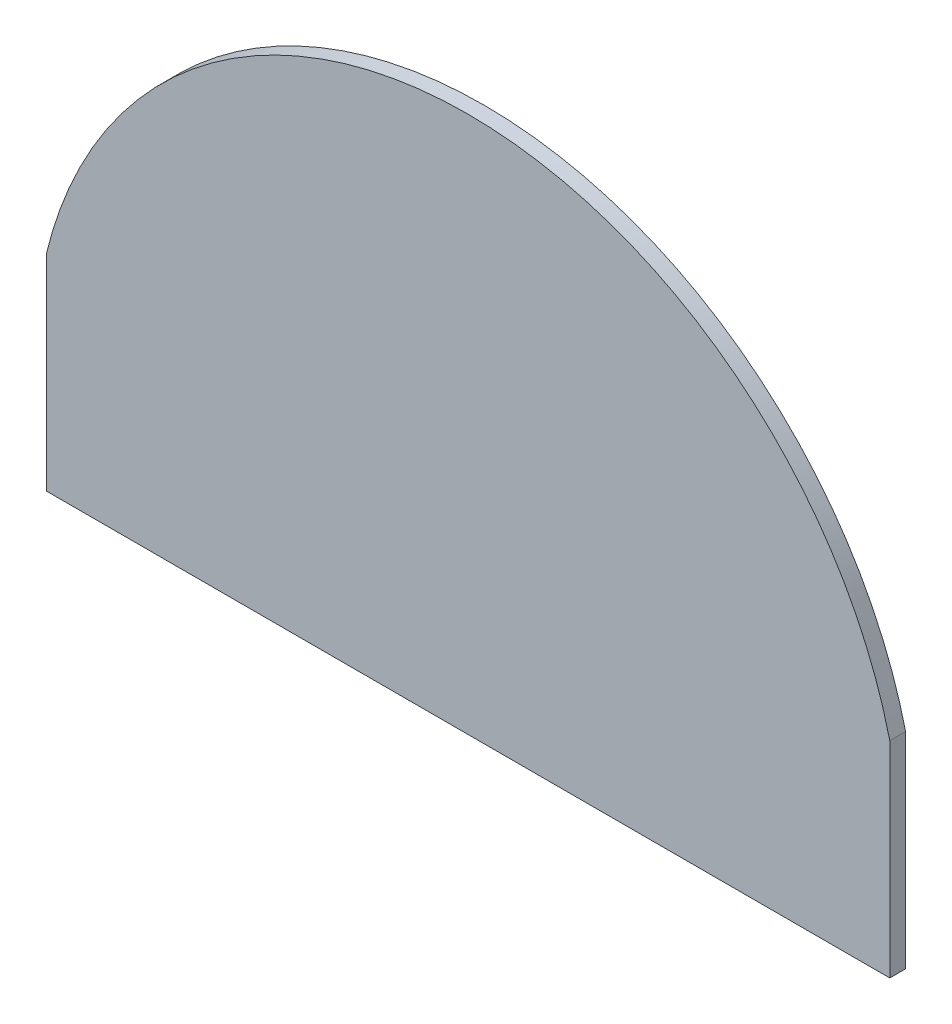
ISO-10303-21;
HEADER;
FILE_DESCRIPTION(('STEP AP214'),'2;1');
FILE_NAME('part.step','',(''),(''),'','','');
FILE_SCHEMA(('AUTOMOTIVE_DESIGN { 1 0 10303 214 1 1 1 1 }'));
ENDSEC;
DATA;
#1=APPLICATION_CONTEXT('core data for automotive mechanical design processes');
#2=APPLICATION_PROTOCOL_DEFINITION('international standard','automotive_design',2000,#1);
#3=PRODUCT_CONTEXT('',#1,'mechanical');
#4=PRODUCT('Part','Part','',(#3));
#5=PRODUCT_RELATED_PRODUCT_CATEGORY('part','',(#4));
#6=PRODUCT_DEFINITION_FORMATION('','',#4);
#7=PRODUCT_DEFINITION_CONTEXT('part definition',#1,'design');
#8=PRODUCT_DEFINITION('design','',#6,#7);
#9=PRODUCT_DEFINITION_SHAPE('','',#8);
#10=(LENGTH_UNIT() NAMED_UNIT(*) SI_UNIT(.MILLI.,.METRE.));
#11=(NAMED_UNIT(*) PLANE_ANGLE_UNIT() SI_UNIT($,.RADIAN.));
#12=(NAMED_UNIT(*) SI_UNIT($,.STERADIAN.) SOLID_ANGLE_UNIT());
#13=UNCERTAINTY_MEASURE_WITH_UNIT(LENGTH_MEASURE(1.E-05),#10,'distance_accuracy_value','');
#14=(GEOMETRIC_REPRESENTATION_CONTEXT(3) GLOBAL_UNCERTAINTY_ASSIGNED_CONTEXT((#13)) GLOBAL_UNIT_ASSIGNED_CONTEXT((#10,
#11,#12)) REPRESENTATION_CONTEXT('',''));
#15=CARTESIAN_POINT('',(0.,0.,0.));
#16=DIRECTION('',(0.,0.,1.));
#17=DIRECTION('',(1.,0.,0.));
#18=AXIS2_PLACEMENT_3D('',#15,#16,#17);
#19=CARTESIAN_POINT('',(80.,5.,53.));
#20=DIRECTION('',(0.,1.,0.));
#21=DIRECTION('',(0.,0.,1.));
#22=AXIS2_PLACEMENT_3D('',#19,#20,#21);
#23=PLANE('',#22);
#24=DIRECTION('',(1.,0.,0.));
#25=VECTOR('',#24,1.);
#26=CARTESIAN_POINT('',(80.,5.,50.));
#27=LINE('',#26,#25);
#28=CARTESIAN_POINT('',(-80.,5.,50.));
#29=VERTEX_POINT('',#28);
#30=CARTESIAN_POINT('',(80.,5.,50.));
#31=VERTEX_POINT('',#30);
#32=EDGE_CURVE('E123',#29,#31,#27,.T.);
#33=ORIENTED_EDGE('',*,*,#32,.T.);
#34=DIRECTION('',(0.,0.,-1.));
#35=VECTOR('',#34,1.);
#36=CARTESIAN_POINT('',(80.,5.,53.));
#37=LINE('',#36,#35);
#38=CARTESIAN_POINT('',(80.,5.,53.));
#39=VERTEX_POINT('',#38);
#40=EDGE_CURVE('E11',#39,#31,#37,.T.);
#41=ORIENTED_EDGE('',*,*,#40,.F.);
#42=DIRECTION('',(1.,0.,0.));
#43=VECTOR('',#42,1.);
#44=CARTESIAN_POINT('',(80.,5.,53.));
#45=LINE('',#44,#43);
#46=CARTESIAN_POINT('',(-80.,5.,53.));
#47=VERTEX_POINT('',#46);
#48=EDGE_CURVE('E88',#47,#39,#45,.T.);
#49=ORIENTED_EDGE('',*,*,#48,.F.);
#50=DIRECTION('',(0.,0.,-1.));
#51=VECTOR('',#50,1.);
#52=CARTESIAN_POINT('',(-80.,5.,53.));
#53=LINE('',#52,#51);
#54=EDGE_CURVE('E129',#47,#29,#53,.T.);
#55=ORIENTED_EDGE('',*,*,#54,.T.);
#56=EDGE_LOOP('',(#33,#41,#49,#55));
#57=FACE_BOUND('',#56,.T.);
#58=ADVANCED_FACE('F33',(#57),#23,.F.);
#59=CARTESIAN_POINT('',(80.,44.,53.));
#60=DIRECTION('',(-1.,0.,0.));
#61=DIRECTION('',(0.,0.,1.));
#62=AXIS2_PLACEMENT_3D('',#59,#60,#61);
#63=PLANE('',#62);
#64=DIRECTION('',(0.,1.,0.));
#65=VECTOR('',#64,1.);
#66=CARTESIAN_POINT('',(80.,44.,50.));
#67=LINE('',#66,#65);
#68=CARTESIAN_POINT('',(80.,44.,50.));
#69=VERTEX_POINT('',#68);
#70=EDGE_CURVE('E92',#31,#69,#67,.T.);
#71=ORIENTED_EDGE('',*,*,#70,.T.);
#72=DIRECTION('',(0.,0.,-1.));
#73=VECTOR('',#72,1.);
#74=CARTESIAN_POINT('',(80.,44.,53.));
#75=LINE('',#74,#73);
#76=CARTESIAN_POINT('',(80.,44.,53.));
#77=VERTEX_POINT('',#76);
#78=EDGE_CURVE('E42',#77,#69,#75,.T.);
#79=ORIENTED_EDGE('',*,*,#78,.F.);
#80=DIRECTION('',(0.,1.,0.));
#81=VECTOR('',#80,1.);
#82=CARTESIAN_POINT('',(80.,44.,53.));
#83=LINE('',#82,#81);
#84=EDGE_CURVE('E82',#39,#77,#83,.T.);
#85=ORIENTED_EDGE('',*,*,#84,.F.);
#86=ORIENTED_EDGE('',*,*,#40,.T.);
#87=EDGE_LOOP('',(#71,#79,#85,#86));
#88=FACE_BOUND('',#87,.T.);
#89=ADVANCED_FACE('F91',(#88),#63,.F.);
#90=CARTESIAN_POINT('',(80.,44.,53.));
#91=CARTESIAN_POINT('',(79.1856423691684,47.3595249154978,53.));
#92=CARTESIAN_POINT('',(78.0909598706326,50.642993584445,53.));
#93=CARTESIAN_POINT('',(76.9963689580524,53.9261875439524,53.));
#94=CARTESIAN_POINT('',(75.6326756633384,57.1005451400095,53.));
#95=CARTESIAN_POINT('',(74.2696153673397,60.2734292637777,53.));
#96=CARTESIAN_POINT('',(72.6431432727945,63.3249304899754,53.));
#97=CARTESIAN_POINT('',(71.0182122542434,66.37354043061,53.));
#98=CARTESIAN_POINT('',(69.1464912003929,69.2713742767161,53.));
#99=CARTESIAN_POINT('',(67.2770787165034,72.1656339512568,53.));
#100=CARTESIAN_POINT('',(65.1695498112878,74.8966771419375,53.));
#101=CARTESIAN_POINT('',(63.0653588745607,77.6233948232083,53.));
#102=CARTESIAN_POINT('',(60.7441394765016,80.1616122153271,53.));
#103=CARTESIAN_POINT('',(58.4273890884949,82.6949428143019,53.));
#104=CARTESIAN_POINT('',(55.9044303575257,85.0290873389293,53.));
#105=CARTESIAN_POINT('',(53.3874784774677,87.3576745557844,53.));
#106=CARTESIAN_POINT('',(50.6886085514487,89.4670048714416,53.));
#107=CARTESIAN_POINT('',(45.4564713291366,93.5562370172015,53.));
#108=CARTESIAN_POINT('',(39.6363700906136,96.7535238934488,53.));
#109=CARTESIAN_POINT('',(33.5997700173089,100.069744935066,53.));
#110=CARTESIAN_POINT('',(27.0992967954393,102.336015415853,53.));
#111=CARTESIAN_POINT('',(20.5644444069193,104.614271561048,53.));
#112=CARTESIAN_POINT('',(13.7400927779922,105.769784194878,53.));
#113=CARTESIAN_POINT('',(10.3332170125164,106.346643097079,53.));
#114=CARTESIAN_POINT('',(6.88899388675884,106.635771433462,53.));
#115=CARTESIAN_POINT('',(3.44801932413832,106.924627066358,53.));
#116=CARTESIAN_POINT('',(0.,106.924604144567,53.));
#117=CARTESIAN_POINT('',(-3.44911350415308,106.924581215502,53.));
#118=CARTESIAN_POINT('',(-6.88899388675888,106.635771433462,53.));
#119=CARTESIAN_POINT('',(-10.3343025012181,106.346505901139,53.));
#120=CARTESIAN_POINT('',(-13.7400927779922,105.769784194878,53.));
#121=CARTESIAN_POINT('',(-20.5655069719298,104.613998253885,53.));
#122=CARTESIAN_POINT('',(-27.0992967954394,102.336015415853,53.));
#123=CARTESIAN_POINT('',(-33.6007668750986,100.069300742823,53.));
#124=CARTESIAN_POINT('',(-39.6363700906137,96.7535238934488,53.));
#125=CARTESIAN_POINT('',(-45.4573794217874,93.5556383978151,53.));
#126=CARTESIAN_POINT('',(-50.6886085514488,89.4670048714416,53.));
#127=CARTESIAN_POINT('',(-53.3883066968154,87.3569699112736,53.));
#128=CARTESIAN_POINT('',(-55.9044303575258,85.0290873389293,53.));
#129=CARTESIAN_POINT('',(-58.4281566217244,82.6941709437084,53.));
#130=CARTESIAN_POINT('',(-60.7441394765017,80.1616122153271,53.));
#131=CARTESIAN_POINT('',(-63.0660615908617,77.6225588258712,53.));
#132=CARTESIAN_POINT('',(-65.1695498112878,74.8966771419375,53.));
#133=CARTESIAN_POINT('',(-67.2777096840496,72.164741527484,53.));
#134=CARTESIAN_POINT('',(-69.1464912003929,69.2713742767161,53.));
#135=CARTESIAN_POINT('',(-71.0187674876344,66.3725961977818,53.));
#136=CARTESIAN_POINT('',(-72.6431432727946,63.3249304899754,53.));
#137=CARTESIAN_POINT('',(-74.270089872002,60.2724414020839,53.));
#138=CARTESIAN_POINT('',(-75.6326756633385,57.1005451400095,53.));
#139=CARTESIAN_POINT('',(-76.9967592893647,53.925162142433,53.));
#140=CARTESIAN_POINT('',(-78.0909598706326,50.642993584445,53.));
#141=CARTESIAN_POINT('',(-79.1857715703775,47.3589919129638,53.));
#142=CARTESIAN_POINT('',(-80.0000000000001,44.,53.));
#143=B_SPLINE_CURVE_WITH_KNOTS('',2,(#90,#91,#92,#93,#94,#95,#96,#97,#98,#99,#100,#101,#102,
#103,#104,#105,#106,#107,#108,#109,#110,#111,#112,#113,#114,#115,#116,#117,#118,#119,#120,#121,
#122,#123,#124,#125,#126,#127,#128,#129,#130,#131,#132,#133,#134,#135,#136,#137,#138,#139,#140,
#141,#142),.UNSPECIFIED.,.F.,.F.,(3,2,2,2,2,2,2,2,2,2,2,2,2,2,2,2,2,2,2,2,2,2,2,2,2,2,3),(0.,
0.03125,0.0625,0.09375,0.125,0.15625,0.1875,0.21875,0.25,0.3125,0.375,0.4375,0.46875,0.5,
0.53125,0.5625,0.625,0.6875,0.75,0.78125,0.8125,0.84375,0.875,0.90625,0.9375,0.96875,1.),.UNSPECIFIED.);
#144=DIRECTION('',(0.,0.,-1.));
#145=VECTOR('',#144,1.);
#146=SURFACE_OF_LINEAR_EXTRUSION('',#143,#145);
#147=CARTESIAN_POINT('',(80.,44.,50.));
#148=CARTESIAN_POINT('',(79.1856423691684,47.3595249154978,50.));
#149=CARTESIAN_POINT('',(78.0909598706326,50.642993584445,50.));
#150=CARTESIAN_POINT('',(76.9963689580524,53.9261875439524,50.));
#151=CARTESIAN_POINT('',(75.6326756633384,57.1005451400095,50.));
#152=CARTESIAN_POINT('',(74.2696153673397,60.2734292637777,50.));
#153=CARTESIAN_POINT('',(72.6431432727945,63.3249304899754,50.));
#154=CARTESIAN_POINT('',(71.0182122542434,66.37354043061,50.));
#155=CARTESIAN_POINT('',(69.1464912003929,69.2713742767161,50.));
#156=CARTESIAN_POINT('',(67.2770787165034,72.1656339512568,50.));
#157=CARTESIAN_POINT('',(65.1695498112878,74.8966771419375,50.));
#158=CARTESIAN_POINT('',(63.0653588745607,77.6233948232083,50.));
#159=CARTESIAN_POINT('',(60.7441394765016,80.1616122153271,50.));
#160=CARTESIAN_POINT('',(58.4273890884949,82.6949428143019,50.));
#161=CARTESIAN_POINT('',(55.9044303575257,85.0290873389293,50.));
#162=CARTESIAN_POINT('',(53.3874784774677,87.3576745557844,50.));
#163=CARTESIAN_POINT('',(50.6886085514487,89.4670048714416,50.));
#164=CARTESIAN_POINT('',(45.4564713291366,93.5562370172015,50.));
#165=CARTESIAN_POINT('',(39.6363700906136,96.7535238934488,50.));
#166=CARTESIAN_POINT('',(33.5997700173089,100.069744935066,50.));
#167=CARTESIAN_POINT('',(27.0992967954393,102.336015415853,50.));
#168=CARTESIAN_POINT('',(20.5644444069193,104.614271561048,50.));
#169=CARTESIAN_POINT('',(13.7400927779922,105.769784194878,50.));
#170=CARTESIAN_POINT('',(10.3332170125164,106.346643097079,50.));
#171=CARTESIAN_POINT('',(6.88899388675884,106.635771433462,50.));
#172=CARTESIAN_POINT('',(3.44801932413832,106.924627066358,50.));
#173=CARTESIAN_POINT('',(0.,106.924604144567,50.));
#174=CARTESIAN_POINT('',(-3.44911350415308,106.924581215502,50.));
#175=CARTESIAN_POINT('',(-6.88899388675888,106.635771433462,50.));
#176=CARTESIAN_POINT('',(-10.3343025012181,106.346505901139,50.));
#177=CARTESIAN_POINT('',(-13.7400927779922,105.769784194878,50.));
#178=CARTESIAN_POINT('',(-20.5655069719298,104.613998253885,50.));
#179=CARTESIAN_POINT('',(-27.0992967954394,102.336015415853,50.));
#180=CARTESIAN_POINT('',(-33.6007668750986,100.069300742823,50.));
#181=CARTESIAN_POINT('',(-39.6363700906137,96.7535238934488,50.));
#182=CARTESIAN_POINT('',(-45.4573794217874,93.5556383978151,50.));
#183=CARTESIAN_POINT('',(-50.6886085514488,89.4670048714416,50.));
#184=CARTESIAN_POINT('',(-53.3883066968154,87.3569699112736,50.));
#185=CARTESIAN_POINT('',(-55.9044303575258,85.0290873389293,50.));
#186=CARTESIAN_POINT('',(-58.4281566217244,82.6941709437084,50.));
#187=CARTESIAN_POINT('',(-60.7441394765017,80.1616122153271,50.));
#188=CARTESIAN_POINT('',(-63.0660615908617,77.6225588258712,50.));
#189=CARTESIAN_POINT('',(-65.1695498112878,74.8966771419375,50.));
#190=CARTESIAN_POINT('',(-67.2777096840496,72.164741527484,50.));
#191=CARTESIAN_POINT('',(-69.1464912003929,69.2713742767161,50.));
#192=CARTESIAN_POINT('',(-71.0187674876344,66.3725961977818,50.));
#193=CARTESIAN_POINT('',(-72.6431432727946,63.3249304899754,50.));
#194=CARTESIAN_POINT('',(-74.270089872002,60.2724414020839,50.));
#195=CARTESIAN_POINT('',(-75.6326756633385,57.1005451400095,50.));
#196=CARTESIAN_POINT('',(-76.9967592893647,53.925162142433,50.));
#197=CARTESIAN_POINT('',(-78.0909598706326,50.642993584445,50.));
#198=CARTESIAN_POINT('',(-79.1857715703775,47.3589919129638,50.));
#199=CARTESIAN_POINT('',(-80.0000000000001,44.,50.));
#200=B_SPLINE_CURVE_WITH_KNOTS('',2,(#147,#148,#149,#150,#151,#152,#153,#154,#155,#156,#157,
#158,#159,#160,#161,#162,#163,#164,#165,#166,#167,#168,#169,#170,#171,#172,#173,#174,#175,#176,
#177,#178,#179,#180,#181,#182,#183,#184,#185,#186,#187,#188,#189,#190,#191,#192,#193,#194,#195,
#196,#197,#198,#199),.UNSPECIFIED.,.F.,.F.,(3,2,2,2,2,2,2,2,2,2,2,2,2,2,2,2,2,2,2,2,2,2,2,2,2,2,
3),(0.,0.03125,0.0625,0.09375,0.125,0.15625,0.1875,0.21875,0.25,0.3125,0.375,0.4375,0.46875,0.5,
0.53125,0.5625,0.625,0.6875,0.75,0.78125,0.8125,0.84375,0.875,0.90625,0.9375,0.96875,1.),.UNSPECIFIED.);
#201=CARTESIAN_POINT('',(-80.,44.,50.));
#202=VERTEX_POINT('',#201);
#203=EDGE_CURVE('E68',#69,#202,#200,.T.);
#204=ORIENTED_EDGE('',*,*,#203,.T.);
#205=DIRECTION('',(0.,0.,-1.));
#206=VECTOR('',#205,1.);
#207=CARTESIAN_POINT('',(-80.,44.,53.));
#208=LINE('',#207,#206);
#209=CARTESIAN_POINT('',(-80.,44.,53.));
#210=VERTEX_POINT('',#209);
#211=EDGE_CURVE('E93',#210,#202,#208,.T.);
#212=ORIENTED_EDGE('',*,*,#211,.F.);
#213=CARTESIAN_POINT('',(-80.0000000000001,44.,53.));
#214=CARTESIAN_POINT('',(-79.1857715703775,47.3589919129638,53.));
#215=CARTESIAN_POINT('',(-78.0909598706326,50.642993584445,53.));
#216=CARTESIAN_POINT('',(-76.9967592893647,53.925162142433,53.));
#217=CARTESIAN_POINT('',(-75.6326756633385,57.1005451400095,53.));
#218=CARTESIAN_POINT('',(-74.270089872002,60.2724414020839,53.));
#219=CARTESIAN_POINT('',(-72.6431432727946,63.3249304899754,53.));
#220=CARTESIAN_POINT('',(-71.0187674876344,66.3725961977818,53.));
#221=CARTESIAN_POINT('',(-69.1464912003929,69.2713742767161,53.));
#222=CARTESIAN_POINT('',(-67.2777096840496,72.164741527484,53.));
#223=CARTESIAN_POINT('',(-65.1695498112878,74.8966771419375,53.));
#224=CARTESIAN_POINT('',(-63.0660615908617,77.6225588258712,53.));
#225=CARTESIAN_POINT('',(-60.7441394765017,80.1616122153271,53.));
#226=CARTESIAN_POINT('',(-58.4281566217244,82.6941709437084,53.));
#227=CARTESIAN_POINT('',(-55.9044303575258,85.0290873389293,53.));
#228=CARTESIAN_POINT('',(-53.3883066968154,87.3569699112736,53.));
#229=CARTESIAN_POINT('',(-50.6886085514488,89.4670048714416,53.));
#230=CARTESIAN_POINT('',(-45.4573794217874,93.5556383978151,53.));
#231=CARTESIAN_POINT('',(-39.6363700906137,96.7535238934488,53.));
#232=CARTESIAN_POINT('',(-33.6007668750986,100.069300742823,53.));
#233=CARTESIAN_POINT('',(-27.0992967954394,102.336015415853,53.));
#234=CARTESIAN_POINT('',(-20.5655069719298,104.613998253885,53.));
#235=CARTESIAN_POINT('',(-13.7400927779922,105.769784194878,53.));
#236=CARTESIAN_POINT('',(-10.3343025012181,106.346505901139,53.));
#237=CARTESIAN_POINT('',(-6.88899388675888,106.635771433462,53.));
#238=CARTESIAN_POINT('',(-3.44911350415308,106.924581215502,53.));
#239=CARTESIAN_POINT('',(0.,106.924604144567,53.));
#240=CARTESIAN_POINT('',(3.44801932413832,106.924627066358,53.));
#241=CARTESIAN_POINT('',(6.88899388675884,106.635771433462,53.));
#242=CARTESIAN_POINT('',(10.3332170125164,106.346643097079,53.));
#243=CARTESIAN_POINT('',(13.7400927779922,105.769784194878,53.));
#244=CARTESIAN_POINT('',(20.5644444069193,104.614271561048,53.));
#245=CARTESIAN_POINT('',(27.0992967954393,102.336015415853,53.));
#246=CARTESIAN_POINT('',(33.5997700173089,100.069744935066,53.));
#247=CARTESIAN_POINT('',(39.6363700906136,96.7535238934488,53.));
#248=CARTESIAN_POINT('',(45.4564713291366,93.5562370172015,53.));
#249=CARTESIAN_POINT('',(50.6886085514487,89.4670048714416,53.));
#250=CARTESIAN_POINT('',(53.3874784774677,87.3576745557844,53.));
#251=CARTESIAN_POINT('',(55.9044303575257,85.0290873389293,53.));
#252=CARTESIAN_POINT('',(58.4273890884949,82.6949428143019,53.));
#253=CARTESIAN_POINT('',(60.7441394765016,80.1616122153271,53.));
#254=CARTESIAN_POINT('',(63.0653588745607,77.6233948232083,53.));
#255=CARTESIAN_POINT('',(65.1695498112878,74.8966771419375,53.));
#256=CARTESIAN_POINT('',(67.2770787165034,72.1656339512568,53.));
#257=CARTESIAN_POINT('',(69.1464912003929,69.2713742767161,53.));
#258=CARTESIAN_POINT('',(71.0182122542434,66.37354043061,53.));
#259=CARTESIAN_POINT('',(72.6431432727945,63.3249304899754,53.));
#260=CARTESIAN_POINT('',(74.2696153673397,60.2734292637777,53.));
#261=CARTESIAN_POINT('',(75.6326756633384,57.1005451400095,53.));
#262=CARTESIAN_POINT('',(76.9963689580524,53.9261875439524,53.));
#263=CARTESIAN_POINT('',(78.0909598706326,50.642993584445,53.));
#264=CARTESIAN_POINT('',(79.1856423691684,47.3595249154978,53.));
#265=CARTESIAN_POINT('',(80.,44.,53.));
#266=B_SPLINE_CURVE_WITH_KNOTS('',2,(#213,#214,#215,#216,#217,#218,#219,#220,#221,#222,#223,
#224,#225,#226,#227,#228,#229,#230,#231,#232,#233,#234,#235,#236,#237,#238,#239,#240,#241,#242,
#243,#244,#245,#246,#247,#248,#249,#250,#251,#252,#253,#254,#255,#256,#257,#258,#259,#260,#261,
#262,#263,#264,#265),.UNSPECIFIED.,.F.,.F.,(3,2,2,2,2,2,2,2,2,2,2,2,2,2,2,2,2,2,2,2,2,2,2,2,2,2,
3),(0.,0.03125,0.0625,0.09375,0.125,0.15625,0.1875,0.21875,0.25,0.3125,0.375,0.4375,0.46875,0.5,
0.53125,0.5625,0.625,0.6875,0.75,0.78125,0.8125,0.84375,0.875,0.90625,0.9375,0.96875,1.),.UNSPECIFIED.);
#267=EDGE_CURVE('E85',#77,#210,#266,.F.);
#268=ORIENTED_EDGE('',*,*,#267,.F.);
#269=ORIENTED_EDGE('',*,*,#78,.T.);
#270=EDGE_LOOP('',(#204,#212,#268,#269));
#271=FACE_BOUND('',#270,.T.);
#272=ADVANCED_FACE('F96',(#271),#146,.F.);
#273=CARTESIAN_POINT('',(-80.,44.,53.));
#274=DIRECTION('',(1.,0.,0.));
#275=DIRECTION('',(0.,0.,-1.));
#276=AXIS2_PLACEMENT_3D('',#273,#274,#275);
#277=PLANE('',#276);
#278=DIRECTION('',(0.,-1.,0.));
#279=VECTOR('',#278,1.);
#280=CARTESIAN_POINT('',(-80.,44.,50.));
#281=LINE('',#280,#279);
#282=EDGE_CURVE('E75',#202,#29,#281,.T.);
#283=ORIENTED_EDGE('',*,*,#282,.T.);
#284=ORIENTED_EDGE('',*,*,#54,.F.);
#285=DIRECTION('',(0.,-1.,0.));
#286=VECTOR('',#285,1.);
#287=CARTESIAN_POINT('',(-80.,44.,53.));
#288=LINE('',#287,#286);
#289=EDGE_CURVE('E51',#210,#47,#288,.T.);
#290=ORIENTED_EDGE('',*,*,#289,.F.);
#291=ORIENTED_EDGE('',*,*,#211,.T.);
#292=EDGE_LOOP('',(#283,#284,#290,#291));
#293=FACE_BOUND('',#292,.T.);
#294=ADVANCED_FACE('F115',(#293),#277,.F.);
#295=CARTESIAN_POINT('',(0.,106.924604144567,53.));
#296=DIRECTION('',(0.,0.,-1.));
#297=DIRECTION('',(-1.,0.,0.));
#298=AXIS2_PLACEMENT_3D('',#295,#296,#297);
#299=PLANE('',#298);
#300=ORIENTED_EDGE('',*,*,#48,.T.);
#301=ORIENTED_EDGE('',*,*,#84,.T.);
#302=ORIENTED_EDGE('',*,*,#267,.T.);
#303=ORIENTED_EDGE('',*,*,#289,.T.);
#304=EDGE_LOOP('',(#300,#301,#302,#303));
#305=FACE_BOUND('',#304,.T.);
#306=ADVANCED_FACE('F83',(#305),#299,.F.);
#307=CARTESIAN_POINT('',(0.,106.924604144567,50.));
#308=DIRECTION('',(0.,0.,-1.));
#309=DIRECTION('',(-1.,0.,0.));
#310=AXIS2_PLACEMENT_3D('',#307,#308,#309);
#311=PLANE('',#310);
#312=ORIENTED_EDGE('',*,*,#32,.F.);
#313=ORIENTED_EDGE('',*,*,#282,.F.);
#314=ORIENTED_EDGE('',*,*,#203,.F.);
#315=ORIENTED_EDGE('',*,*,#70,.F.);
#316=EDGE_LOOP('',(#312,#313,#314,#315));
#317=FACE_BOUND('',#316,.T.);
#318=ADVANCED_FACE('F153',(#317),#311,.T.);
#319=CLOSED_SHELL('',(#58,#89,#272,#294,#306,#318));
#320=MANIFOLD_SOLID_BREP('B2',#319);
#321=ADVANCED_BREP_SHAPE_REPRESENTATION('',(#18,#320),#14);
#322=SHAPE_DEFINITION_REPRESENTATION(#9,#321);
ENDSEC;
END-ISO-10303-21;
